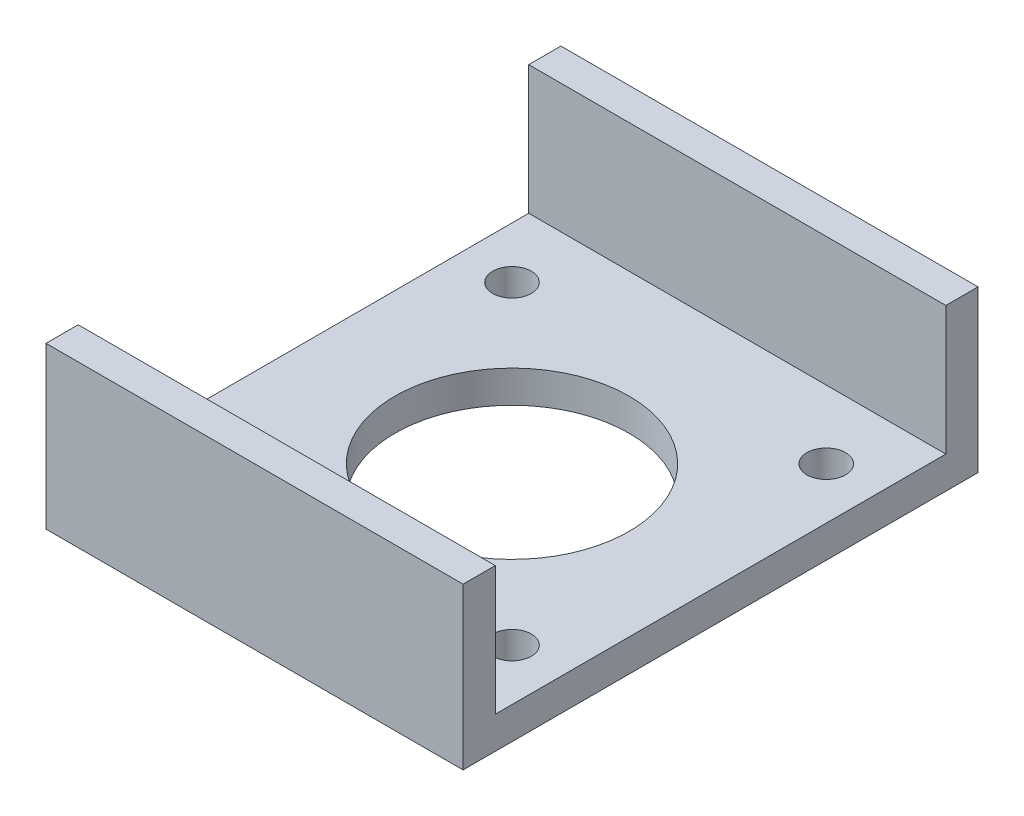
ISO-10303-21;
HEADER;
FILE_DESCRIPTION(('STEP AP214'),'2;1');
FILE_NAME('part.step','',(''),(''),'','','');
FILE_SCHEMA(('AUTOMOTIVE_DESIGN { 1 0 10303 214 1 1 1 1 }'));
ENDSEC;
DATA;
#1=APPLICATION_CONTEXT('core data for automotive mechanical design processes');
#2=APPLICATION_PROTOCOL_DEFINITION('international standard','automotive_design',2000,#1);
#3=PRODUCT_CONTEXT('',#1,'mechanical');
#4=PRODUCT('Part','Part','',(#3));
#5=PRODUCT_RELATED_PRODUCT_CATEGORY('part','',(#4));
#6=PRODUCT_DEFINITION_FORMATION('','',#4);
#7=PRODUCT_DEFINITION_CONTEXT('part definition',#1,'design');
#8=PRODUCT_DEFINITION('design','',#6,#7);
#9=PRODUCT_DEFINITION_SHAPE('','',#8);
#10=(LENGTH_UNIT() NAMED_UNIT(*) SI_UNIT(.MILLI.,.METRE.));
#11=(NAMED_UNIT(*) PLANE_ANGLE_UNIT() SI_UNIT($,.RADIAN.));
#12=(NAMED_UNIT(*) SI_UNIT($,.STERADIAN.) SOLID_ANGLE_UNIT());
#13=UNCERTAINTY_MEASURE_WITH_UNIT(LENGTH_MEASURE(1.E-05),#10,'distance_accuracy_value','');
#14=(GEOMETRIC_REPRESENTATION_CONTEXT(3) GLOBAL_UNCERTAINTY_ASSIGNED_CONTEXT((#13)) GLOBAL_UNIT_ASSIGNED_CONTEXT((#10,
#11,#12)) REPRESENTATION_CONTEXT('',''));
#15=CARTESIAN_POINT('',(0.,0.,0.));
#16=DIRECTION('',(0.,0.,1.));
#17=DIRECTION('',(1.,0.,0.));
#18=AXIS2_PLACEMENT_3D('',#15,#16,#17);
#19=CARTESIAN_POINT('',(0.,3.175,0.));
#20=DIRECTION('',(0.,-1.,0.));
#21=DIRECTION('',(0.,0.,-1.));
#22=AXIS2_PLACEMENT_3D('',#19,#20,#21);
#23=PLANE('',#22);
#24=CARTESIAN_POINT('',(0.,3.175,0.));
#25=DIRECTION('',(0.,1.,0.));
#26=DIRECTION('',(0.,0.,1.));
#27=AXIS2_PLACEMENT_3D('',#24,#25,#26);
#28=CIRCLE('',#27,11.557);
#29=CARTESIAN_POINT('',(0.,3.175,11.557));
#30=VERTEX_POINT('',#29);
#31=EDGE_CURVE('E200',#30,#30,#28,.T.);
#32=ORIENTED_EDGE('',*,*,#31,.F.);
#33=EDGE_LOOP('',(#32));
#34=FACE_BOUND('',#33,.T.);
#35=CARTESIAN_POINT('',(-15.499999988,3.175,-15.499999988));
#36=DIRECTION('',(0.,1.,0.));
#37=DIRECTION('',(0.,0.,1.));
#38=AXIS2_PLACEMENT_3D('',#35,#36,#37);
#39=CIRCLE('',#38,1.905);
#40=CARTESIAN_POINT('',(-15.499999988,3.175,-13.594999988));
#41=VERTEX_POINT('',#40);
#42=EDGE_CURVE('E192',#41,#41,#39,.T.);
#43=ORIENTED_EDGE('',*,*,#42,.F.);
#44=EDGE_LOOP('',(#43));
#45=FACE_BOUND('',#44,.T.);
#46=CARTESIAN_POINT('',(15.499999988,3.175,-15.499999988));
#47=DIRECTION('',(0.,1.,0.));
#48=DIRECTION('',(0.,0.,1.));
#49=AXIS2_PLACEMENT_3D('',#46,#47,#48);
#50=CIRCLE('',#49,1.905);
#51=CARTESIAN_POINT('',(15.499999988,3.175,-13.594999988));
#52=VERTEX_POINT('',#51);
#53=EDGE_CURVE('E184',#52,#52,#50,.T.);
#54=ORIENTED_EDGE('',*,*,#53,.F.);
#55=EDGE_LOOP('',(#54));
#56=FACE_BOUND('',#55,.T.);
#57=CARTESIAN_POINT('',(15.499999988,3.175,15.499999988));
#58=DIRECTION('',(0.,1.,0.));
#59=DIRECTION('',(0.,0.,1.));
#60=AXIS2_PLACEMENT_3D('',#57,#58,#59);
#61=CIRCLE('',#60,1.905);
#62=CARTESIAN_POINT('',(15.499999988,3.175,17.404999988));
#63=VERTEX_POINT('',#62);
#64=EDGE_CURVE('E176',#63,#63,#61,.T.);
#65=ORIENTED_EDGE('',*,*,#64,.F.);
#66=EDGE_LOOP('',(#65));
#67=FACE_BOUND('',#66,.T.);
#68=CARTESIAN_POINT('',(-15.499999988,3.175,15.499999988));
#69=DIRECTION('',(0.,1.,0.));
#70=DIRECTION('',(0.,0.,1.));
#71=AXIS2_PLACEMENT_3D('',#68,#69,#70);
#72=CIRCLE('',#71,1.905);
#73=CARTESIAN_POINT('',(-15.499999988,3.175,17.404999988));
#74=VERTEX_POINT('',#73);
#75=EDGE_CURVE('E168',#74,#74,#72,.T.);
#76=ORIENTED_EDGE('',*,*,#75,.F.);
#77=EDGE_LOOP('',(#76));
#78=FACE_BOUND('',#77,.T.);
#79=DIRECTION('',(1.,0.,0.));
#80=VECTOR('',#79,1.);
#81=CARTESIAN_POINT('',(-20.574,3.175,-22.225));
#82=LINE('',#81,#80);
#83=CARTESIAN_POINT('',(-20.574,3.175,-22.225));
#84=VERTEX_POINT('',#83);
#85=CARTESIAN_POINT('',(20.574,3.175,-22.225));
#86=VERTEX_POINT('',#85);
#87=EDGE_CURVE('E128',#84,#86,#82,.T.);
#88=ORIENTED_EDGE('',*,*,#87,.F.);
#89=DIRECTION('',(0.,0.,1.));
#90=VECTOR('',#89,1.);
#91=CARTESIAN_POINT('',(-20.574,3.175,25.4));
#92=LINE('',#91,#90);
#93=CARTESIAN_POINT('',(-20.574,3.175,22.225));
#94=VERTEX_POINT('',#93);
#95=EDGE_CURVE('E210',#84,#94,#92,.T.);
#96=ORIENTED_EDGE('',*,*,#95,.T.);
#97=DIRECTION('',(-1.,0.,0.));
#98=VECTOR('',#97,1.);
#99=CARTESIAN_POINT('',(-20.574,3.175,22.225));
#100=LINE('',#99,#98);
#101=CARTESIAN_POINT('',(20.574,3.175,22.225));
#102=VERTEX_POINT('',#101);
#103=EDGE_CURVE('E60',#102,#94,#100,.T.);
#104=ORIENTED_EDGE('',*,*,#103,.F.);
#105=DIRECTION('',(0.,0.,-1.));
#106=VECTOR('',#105,1.);
#107=CARTESIAN_POINT('',(20.574,3.175,25.4));
#108=LINE('',#107,#106);
#109=EDGE_CURVE('E55',#102,#86,#108,.T.);
#110=ORIENTED_EDGE('',*,*,#109,.T.);
#111=EDGE_LOOP('',(#88,#96,#104,#110));
#112=FACE_BOUND('',#111,.T.);
#113=ADVANCED_FACE('F39',(#34,#45,#56,#67,#78,#112),#23,.F.);
#114=CARTESIAN_POINT('',(0.,0.,0.));
#115=DIRECTION('',(0.,-1.,0.));
#116=DIRECTION('',(0.,0.,-1.));
#117=AXIS2_PLACEMENT_3D('',#114,#115,#116);
#118=PLANE('',#117);
#119=CARTESIAN_POINT('',(15.499999988,0.,15.499999988));
#120=DIRECTION('',(0.,1.,0.));
#121=DIRECTION('',(0.,0.,1.));
#122=AXIS2_PLACEMENT_3D('',#119,#120,#121);
#123=CIRCLE('',#122,1.905);
#124=CARTESIAN_POINT('',(15.499999988,0.,17.404999988));
#125=VERTEX_POINT('',#124);
#126=EDGE_CURVE('E172',#125,#125,#123,.T.);
#127=ORIENTED_EDGE('',*,*,#126,.T.);
#128=EDGE_LOOP('',(#127));
#129=FACE_BOUND('',#128,.T.);
#130=CARTESIAN_POINT('',(-15.499999988,0.,-15.499999988));
#131=DIRECTION('',(0.,1.,0.));
#132=DIRECTION('',(0.,0.,1.));
#133=AXIS2_PLACEMENT_3D('',#130,#131,#132);
#134=CIRCLE('',#133,1.905);
#135=CARTESIAN_POINT('',(-15.499999988,0.,-13.594999988));
#136=VERTEX_POINT('',#135);
#137=EDGE_CURVE('E188',#136,#136,#134,.T.);
#138=ORIENTED_EDGE('',*,*,#137,.T.);
#139=EDGE_LOOP('',(#138));
#140=FACE_BOUND('',#139,.T.);
#141=DIRECTION('',(0.,0.,-1.));
#142=VECTOR('',#141,1.);
#143=CARTESIAN_POINT('',(20.574,0.,25.4));
#144=LINE('',#143,#142);
#145=CARTESIAN_POINT('',(20.574,0.,25.4));
#146=VERTEX_POINT('',#145);
#147=CARTESIAN_POINT('',(20.574,0.,-25.4));
#148=VERTEX_POINT('',#147);
#149=EDGE_CURVE('E204',#146,#148,#144,.T.);
#150=ORIENTED_EDGE('',*,*,#149,.F.);
#151=DIRECTION('',(1.,0.,0.));
#152=VECTOR('',#151,1.);
#153=CARTESIAN_POINT('',(-20.574,0.,25.4));
#154=LINE('',#153,#152);
#155=CARTESIAN_POINT('',(-20.574,0.,25.4));
#156=VERTEX_POINT('',#155);
#157=EDGE_CURVE('E211',#156,#146,#154,.T.);
#158=ORIENTED_EDGE('',*,*,#157,.F.);
#159=DIRECTION('',(0.,0.,1.));
#160=VECTOR('',#159,1.);
#161=CARTESIAN_POINT('',(-20.574,0.,25.4));
#162=LINE('',#161,#160);
#163=CARTESIAN_POINT('',(-20.574,0.,-25.4));
#164=VERTEX_POINT('',#163);
#165=EDGE_CURVE('E220',#164,#156,#162,.T.);
#166=ORIENTED_EDGE('',*,*,#165,.F.);
#167=DIRECTION('',(-1.,0.,0.));
#168=VECTOR('',#167,1.);
#169=CARTESIAN_POINT('',(-20.574,0.,-25.4));
#170=LINE('',#169,#168);
#171=EDGE_CURVE('E108',#148,#164,#170,.T.);
#172=ORIENTED_EDGE('',*,*,#171,.F.);
#173=EDGE_LOOP('',(#150,#158,#166,#172));
#174=FACE_BOUND('',#173,.T.);
#175=CARTESIAN_POINT('',(0.,0.,0.));
#176=DIRECTION('',(0.,1.,0.));
#177=DIRECTION('',(0.,0.,1.));
#178=AXIS2_PLACEMENT_3D('',#175,#176,#177);
#179=CIRCLE('',#178,11.557);
#180=CARTESIAN_POINT('',(0.,0.,11.557));
#181=VERTEX_POINT('',#180);
#182=EDGE_CURVE('E196',#181,#181,#179,.T.);
#183=ORIENTED_EDGE('',*,*,#182,.T.);
#184=EDGE_LOOP('',(#183));
#185=FACE_BOUND('',#184,.T.);
#186=CARTESIAN_POINT('',(15.499999988,0.,-15.499999988));
#187=DIRECTION('',(0.,1.,0.));
#188=DIRECTION('',(0.,0.,1.));
#189=AXIS2_PLACEMENT_3D('',#186,#187,#188);
#190=CIRCLE('',#189,1.905);
#191=CARTESIAN_POINT('',(15.499999988,0.,-13.594999988));
#192=VERTEX_POINT('',#191);
#193=EDGE_CURVE('E180',#192,#192,#190,.T.);
#194=ORIENTED_EDGE('',*,*,#193,.T.);
#195=EDGE_LOOP('',(#194));
#196=FACE_BOUND('',#195,.T.);
#197=CARTESIAN_POINT('',(-15.499999988,0.,15.499999988));
#198=DIRECTION('',(0.,1.,0.));
#199=DIRECTION('',(0.,0.,1.));
#200=AXIS2_PLACEMENT_3D('',#197,#198,#199);
#201=CIRCLE('',#200,1.905);
#202=CARTESIAN_POINT('',(-15.499999988,0.,17.404999988));
#203=VERTEX_POINT('',#202);
#204=EDGE_CURVE('E167',#203,#203,#201,.T.);
#205=ORIENTED_EDGE('',*,*,#204,.T.);
#206=EDGE_LOOP('',(#205));
#207=FACE_BOUND('',#206,.T.);
#208=ADVANCED_FACE('F237',(#129,#140,#174,#185,#196,#207),#118,.T.);
#209=CARTESIAN_POINT('',(20.574,3.175,25.4));
#210=DIRECTION('',(-1.,0.,0.));
#211=DIRECTION('',(0.,0.,1.));
#212=AXIS2_PLACEMENT_3D('',#209,#210,#211);
#213=PLANE('',#212);
#214=ORIENTED_EDGE('',*,*,#149,.T.);
#215=DIRECTION('',(0.,-1.,0.));
#216=VECTOR('',#215,1.);
#217=CARTESIAN_POINT('',(20.574,3.175,-25.4));
#218=LINE('',#217,#216);
#219=CARTESIAN_POINT('',(20.574,15.875,-25.4));
#220=VERTEX_POINT('',#219);
#221=EDGE_CURVE('E11',#220,#148,#218,.T.);
#222=ORIENTED_EDGE('',*,*,#221,.F.);
#223=DIRECTION('',(0.,0.,-1.));
#224=VECTOR('',#223,1.);
#225=CARTESIAN_POINT('',(20.574,15.875,-25.4));
#226=LINE('',#225,#224);
#227=CARTESIAN_POINT('',(20.574,15.875,-22.225));
#228=VERTEX_POINT('',#227);
#229=EDGE_CURVE('E126',#228,#220,#226,.T.);
#230=ORIENTED_EDGE('',*,*,#229,.F.);
#231=DIRECTION('',(0.,-1.,0.));
#232=VECTOR('',#231,1.);
#233=CARTESIAN_POINT('',(20.574,15.875,-22.225));
#234=LINE('',#233,#232);
#235=EDGE_CURVE('E136',#228,#86,#234,.T.);
#236=ORIENTED_EDGE('',*,*,#235,.T.);
#237=ORIENTED_EDGE('',*,*,#109,.F.);
#238=DIRECTION('',(0.,-1.,0.));
#239=VECTOR('',#238,1.);
#240=CARTESIAN_POINT('',(20.574,15.875,22.225));
#241=LINE('',#240,#239);
#242=CARTESIAN_POINT('',(20.574,15.875,22.225));
#243=VERTEX_POINT('',#242);
#244=EDGE_CURVE('E163',#243,#102,#241,.T.);
#245=ORIENTED_EDGE('',*,*,#244,.F.);
#246=DIRECTION('',(0.,0.,-1.));
#247=VECTOR('',#246,1.);
#248=CARTESIAN_POINT('',(20.574,15.875,25.4));
#249=LINE('',#248,#247);
#250=CARTESIAN_POINT('',(20.574,15.875,25.4));
#251=VERTEX_POINT('',#250);
#252=EDGE_CURVE('E151',#251,#243,#249,.T.);
#253=ORIENTED_EDGE('',*,*,#252,.F.);
#254=DIRECTION('',(0.,-1.,0.));
#255=VECTOR('',#254,1.);
#256=CARTESIAN_POINT('',(20.574,3.175,25.4));
#257=LINE('',#256,#255);
#258=EDGE_CURVE('E214',#251,#146,#257,.T.);
#259=ORIENTED_EDGE('',*,*,#258,.T.);
#260=EDGE_LOOP('',(#214,#222,#230,#236,#237,#245,#253,#259));
#261=FACE_BOUND('',#260,.T.);
#262=ADVANCED_FACE('F41',(#261),#213,.F.);
#263=CARTESIAN_POINT('',(-20.574,3.175,-25.4));
#264=DIRECTION('',(0.,0.,1.));
#265=DIRECTION('',(1.,0.,0.));
#266=AXIS2_PLACEMENT_3D('',#263,#264,#265);
#267=PLANE('',#266);
#268=ORIENTED_EDGE('',*,*,#171,.T.);
#269=DIRECTION('',(0.,-1.,0.));
#270=VECTOR('',#269,1.);
#271=CARTESIAN_POINT('',(-20.574,3.175,-25.4));
#272=LINE('',#271,#270);
#273=CARTESIAN_POINT('',(-20.574,15.875,-25.4));
#274=VERTEX_POINT('',#273);
#275=EDGE_CURVE('E48',#274,#164,#272,.T.);
#276=ORIENTED_EDGE('',*,*,#275,.F.);
#277=DIRECTION('',(-1.,0.,0.));
#278=VECTOR('',#277,1.);
#279=CARTESIAN_POINT('',(-20.574,15.875,-25.4));
#280=LINE('',#279,#278);
#281=EDGE_CURVE('E107',#220,#274,#280,.T.);
#282=ORIENTED_EDGE('',*,*,#281,.F.);
#283=ORIENTED_EDGE('',*,*,#221,.T.);
#284=EDGE_LOOP('',(#268,#276,#282,#283));
#285=FACE_BOUND('',#284,.T.);
#286=ADVANCED_FACE('F105',(#285),#267,.F.);
#287=CARTESIAN_POINT('',(-20.574,3.175,25.4));
#288=DIRECTION('',(1.,0.,0.));
#289=DIRECTION('',(0.,0.,-1.));
#290=AXIS2_PLACEMENT_3D('',#287,#288,#289);
#291=PLANE('',#290);
#292=ORIENTED_EDGE('',*,*,#165,.T.);
#293=DIRECTION('',(0.,-1.,0.));
#294=VECTOR('',#293,1.);
#295=CARTESIAN_POINT('',(-20.574,3.175,25.4));
#296=LINE('',#295,#294);
#297=CARTESIAN_POINT('',(-20.574,15.875,25.4));
#298=VERTEX_POINT('',#297);
#299=EDGE_CURVE('E112',#298,#156,#296,.T.);
#300=ORIENTED_EDGE('',*,*,#299,.F.);
#301=DIRECTION('',(0.,0.,1.));
#302=VECTOR('',#301,1.);
#303=CARTESIAN_POINT('',(-20.574,15.875,25.4));
#304=LINE('',#303,#302);
#305=CARTESIAN_POINT('',(-20.574,15.875,22.225));
#306=VERTEX_POINT('',#305);
#307=EDGE_CURVE('E143',#306,#298,#304,.T.);
#308=ORIENTED_EDGE('',*,*,#307,.F.);
#309=DIRECTION('',(0.,-1.,0.));
#310=VECTOR('',#309,1.);
#311=CARTESIAN_POINT('',(-20.574,15.875,22.225));
#312=LINE('',#311,#310);
#313=EDGE_CURVE('E157',#306,#94,#312,.T.);
#314=ORIENTED_EDGE('',*,*,#313,.T.);
#315=ORIENTED_EDGE('',*,*,#95,.F.);
#316=DIRECTION('',(0.,-1.,0.));
#317=VECTOR('',#316,1.);
#318=CARTESIAN_POINT('',(-20.574,15.875,-22.225));
#319=LINE('',#318,#317);
#320=CARTESIAN_POINT('',(-20.574,15.875,-22.225));
#321=VERTEX_POINT('',#320);
#322=EDGE_CURVE('E117',#321,#84,#319,.T.);
#323=ORIENTED_EDGE('',*,*,#322,.F.);
#324=DIRECTION('',(0.,0.,1.));
#325=VECTOR('',#324,1.);
#326=CARTESIAN_POINT('',(-20.574,15.875,-25.4));
#327=LINE('',#326,#325);
#328=EDGE_CURVE('E114',#274,#321,#327,.T.);
#329=ORIENTED_EDGE('',*,*,#328,.F.);
#330=ORIENTED_EDGE('',*,*,#275,.T.);
#331=EDGE_LOOP('',(#292,#300,#308,#314,#315,#323,#329,#330));
#332=FACE_BOUND('',#331,.T.);
#333=ADVANCED_FACE('F115',(#332),#291,.F.);
#334=CARTESIAN_POINT('',(-20.574,3.175,25.4));
#335=DIRECTION('',(0.,0.,-1.));
#336=DIRECTION('',(-1.,0.,0.));
#337=AXIS2_PLACEMENT_3D('',#334,#335,#336);
#338=PLANE('',#337);
#339=ORIENTED_EDGE('',*,*,#157,.T.);
#340=ORIENTED_EDGE('',*,*,#258,.F.);
#341=DIRECTION('',(1.,0.,0.));
#342=VECTOR('',#341,1.);
#343=CARTESIAN_POINT('',(-20.574,15.875,25.4));
#344=LINE('',#343,#342);
#345=EDGE_CURVE('E147',#298,#251,#344,.T.);
#346=ORIENTED_EDGE('',*,*,#345,.F.);
#347=ORIENTED_EDGE('',*,*,#299,.T.);
#348=EDGE_LOOP('',(#339,#340,#346,#347));
#349=FACE_BOUND('',#348,.T.);
#350=ADVANCED_FACE('F233',(#349),#338,.F.);
#351=CARTESIAN_POINT('',(0.,3.175,0.));
#352=DIRECTION('',(0.,-1.,0.));
#353=DIRECTION('',(0.,0.,-1.));
#354=AXIS2_PLACEMENT_3D('',#351,#352,#353);
#355=CYLINDRICAL_SURFACE('',#354,11.557);
#356=ORIENTED_EDGE('',*,*,#31,.T.);
#357=EDGE_LOOP('',(#356));
#358=FACE_BOUND('',#357,.T.);
#359=ORIENTED_EDGE('',*,*,#182,.F.);
#360=EDGE_LOOP('',(#359));
#361=FACE_BOUND('',#360,.T.);
#362=ADVANCED_FACE('F262',(#358,#361),#355,.F.);
#363=CARTESIAN_POINT('',(-15.499999988,3.175,-15.499999988));
#364=DIRECTION('',(0.,-1.,0.));
#365=DIRECTION('',(0.,0.,-1.));
#366=AXIS2_PLACEMENT_3D('',#363,#364,#365);
#367=CYLINDRICAL_SURFACE('',#366,1.905);
#368=ORIENTED_EDGE('',*,*,#42,.T.);
#369=EDGE_LOOP('',(#368));
#370=FACE_BOUND('',#369,.T.);
#371=ORIENTED_EDGE('',*,*,#137,.F.);
#372=EDGE_LOOP('',(#371));
#373=FACE_BOUND('',#372,.T.);
#374=ADVANCED_FACE('F288',(#370,#373),#367,.F.);
#375=CARTESIAN_POINT('',(15.499999988,3.175,-15.499999988));
#376=DIRECTION('',(0.,-1.,0.));
#377=DIRECTION('',(0.,0.,-1.));
#378=AXIS2_PLACEMENT_3D('',#375,#376,#377);
#379=CYLINDRICAL_SURFACE('',#378,1.905);
#380=ORIENTED_EDGE('',*,*,#53,.T.);
#381=EDGE_LOOP('',(#380));
#382=FACE_BOUND('',#381,.T.);
#383=ORIENTED_EDGE('',*,*,#193,.F.);
#384=EDGE_LOOP('',(#383));
#385=FACE_BOUND('',#384,.T.);
#386=ADVANCED_FACE('F298',(#382,#385),#379,.F.);
#387=CARTESIAN_POINT('',(15.499999988,3.175,15.499999988));
#388=DIRECTION('',(0.,-1.,0.));
#389=DIRECTION('',(0.,0.,-1.));
#390=AXIS2_PLACEMENT_3D('',#387,#388,#389);
#391=CYLINDRICAL_SURFACE('',#390,1.905);
#392=ORIENTED_EDGE('',*,*,#64,.T.);
#393=EDGE_LOOP('',(#392));
#394=FACE_BOUND('',#393,.T.);
#395=ORIENTED_EDGE('',*,*,#126,.F.);
#396=EDGE_LOOP('',(#395));
#397=FACE_BOUND('',#396,.T.);
#398=ADVANCED_FACE('F307',(#394,#397),#391,.F.);
#399=CARTESIAN_POINT('',(-15.499999988,3.175,15.499999988));
#400=DIRECTION('',(0.,-1.,0.));
#401=DIRECTION('',(0.,0.,-1.));
#402=AXIS2_PLACEMENT_3D('',#399,#400,#401);
#403=CYLINDRICAL_SURFACE('',#402,1.905);
#404=ORIENTED_EDGE('',*,*,#75,.T.);
#405=EDGE_LOOP('',(#404));
#406=FACE_BOUND('',#405,.T.);
#407=ORIENTED_EDGE('',*,*,#204,.F.);
#408=EDGE_LOOP('',(#407));
#409=FACE_BOUND('',#408,.T.);
#410=ADVANCED_FACE('F317',(#406,#409),#403,.F.);
#411=CARTESIAN_POINT('',(-20.574,15.875,22.225));
#412=DIRECTION('',(0.,0.,1.));
#413=DIRECTION('',(1.,0.,0.));
#414=AXIS2_PLACEMENT_3D('',#411,#412,#413);
#415=PLANE('',#414);
#416=ORIENTED_EDGE('',*,*,#103,.T.);
#417=ORIENTED_EDGE('',*,*,#313,.F.);
#418=DIRECTION('',(-1.,0.,0.));
#419=VECTOR('',#418,1.);
#420=CARTESIAN_POINT('',(-20.574,15.875,22.225));
#421=LINE('',#420,#419);
#422=EDGE_CURVE('E154',#243,#306,#421,.T.);
#423=ORIENTED_EDGE('',*,*,#422,.F.);
#424=ORIENTED_EDGE('',*,*,#244,.T.);
#425=EDGE_LOOP('',(#416,#417,#423,#424));
#426=FACE_BOUND('',#425,.T.);
#427=ADVANCED_FACE('F247',(#426),#415,.F.);
#428=CARTESIAN_POINT('',(0.,15.875,0.));
#429=DIRECTION('',(0.,-1.,0.));
#430=DIRECTION('',(0.,0.,-1.));
#431=AXIS2_PLACEMENT_3D('',#428,#429,#430);
#432=PLANE('',#431);
#433=ORIENTED_EDGE('',*,*,#307,.T.);
#434=ORIENTED_EDGE('',*,*,#345,.T.);
#435=ORIENTED_EDGE('',*,*,#252,.T.);
#436=ORIENTED_EDGE('',*,*,#422,.T.);
#437=EDGE_LOOP('',(#433,#434,#435,#436));
#438=FACE_BOUND('',#437,.T.);
#439=ADVANCED_FACE('F243',(#438),#432,.F.);
#440=CARTESIAN_POINT('',(-20.574,15.875,-22.225));
#441=DIRECTION('',(0.,0.,-1.));
#442=DIRECTION('',(-1.,0.,0.));
#443=AXIS2_PLACEMENT_3D('',#440,#441,#442);
#444=PLANE('',#443);
#445=ORIENTED_EDGE('',*,*,#87,.T.);
#446=ORIENTED_EDGE('',*,*,#235,.F.);
#447=DIRECTION('',(1.,0.,0.));
#448=VECTOR('',#447,1.);
#449=CARTESIAN_POINT('',(-20.574,15.875,-22.225));
#450=LINE('',#449,#448);
#451=EDGE_CURVE('E121',#321,#228,#450,.T.);
#452=ORIENTED_EDGE('',*,*,#451,.F.);
#453=ORIENTED_EDGE('',*,*,#322,.T.);
#454=EDGE_LOOP('',(#445,#446,#452,#453));
#455=FACE_BOUND('',#454,.T.);
#456=ADVANCED_FACE('F250',(#455),#444,.F.);
#457=CARTESIAN_POINT('',(0.,15.875,0.));
#458=DIRECTION('',(0.,-1.,0.));
#459=DIRECTION('',(0.,0.,-1.));
#460=AXIS2_PLACEMENT_3D('',#457,#458,#459);
#461=PLANE('',#460);
#462=ORIENTED_EDGE('',*,*,#281,.T.);
#463=ORIENTED_EDGE('',*,*,#328,.T.);
#464=ORIENTED_EDGE('',*,*,#451,.T.);
#465=ORIENTED_EDGE('',*,*,#229,.T.);
#466=EDGE_LOOP('',(#462,#463,#464,#465));
#467=FACE_BOUND('',#466,.T.);
#468=ADVANCED_FACE('F124',(#467),#461,.F.);
#469=CLOSED_SHELL('',(#113,#208,#262,#286,#333,#350,#362,#374,#386,#398,#410,#427,#439,#456,#468));
#470=MANIFOLD_SOLID_BREP('B2',#469);
#471=ADVANCED_BREP_SHAPE_REPRESENTATION('',(#18,#470),#14);
#472=SHAPE_DEFINITION_REPRESENTATION(#9,#471);
ENDSEC;
END-ISO-10303-21;
